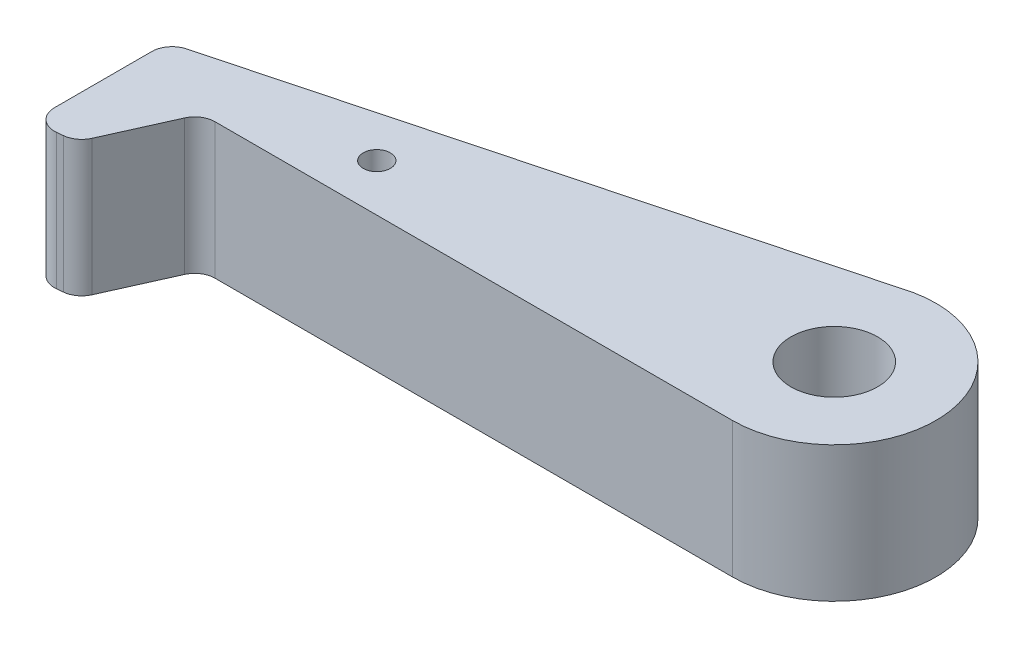
ISO-10303-21;
HEADER;
FILE_DESCRIPTION(('STEP AP214'),'2;1');
FILE_NAME('part.step','',(''),(''),'','','');
FILE_SCHEMA(('AUTOMOTIVE_DESIGN { 1 0 10303 214 1 1 1 1 }'));
ENDSEC;
DATA;
#1=APPLICATION_CONTEXT('core data for automotive mechanical design processes');
#2=APPLICATION_PROTOCOL_DEFINITION('international standard','automotive_design',2000,#1);
#3=PRODUCT_CONTEXT('',#1,'mechanical');
#4=PRODUCT('Part','Part','',(#3));
#5=PRODUCT_RELATED_PRODUCT_CATEGORY('part','',(#4));
#6=PRODUCT_DEFINITION_FORMATION('','',#4);
#7=PRODUCT_DEFINITION_CONTEXT('part definition',#1,'design');
#8=PRODUCT_DEFINITION('design','',#6,#7);
#9=PRODUCT_DEFINITION_SHAPE('','',#8);
#10=(LENGTH_UNIT() NAMED_UNIT(*) SI_UNIT(.MILLI.,.METRE.));
#11=(NAMED_UNIT(*) PLANE_ANGLE_UNIT() SI_UNIT($,.RADIAN.));
#12=(NAMED_UNIT(*) SI_UNIT($,.STERADIAN.) SOLID_ANGLE_UNIT());
#13=UNCERTAINTY_MEASURE_WITH_UNIT(LENGTH_MEASURE(1.E-05),#10,'distance_accuracy_value','');
#14=(GEOMETRIC_REPRESENTATION_CONTEXT(3) GLOBAL_UNCERTAINTY_ASSIGNED_CONTEXT((#13)) GLOBAL_UNIT_ASSIGNED_CONTEXT((#10,
#11,#12)) REPRESENTATION_CONTEXT('',''));
#15=CARTESIAN_POINT('',(0.,0.,0.));
#16=DIRECTION('',(0.,0.,1.));
#17=DIRECTION('',(1.,0.,0.));
#18=AXIS2_PLACEMENT_3D('',#15,#16,#17);
#19=CARTESIAN_POINT('',(45.,10.,-49.1939953097299));
#20=DIRECTION('',(0.,-1.,0.));
#21=DIRECTION('',(0.,0.,-1.));
#22=AXIS2_PLACEMENT_3D('',#19,#20,#21);
#23=CYLINDRICAL_SURFACE('',#22,7.5);
#24=CARTESIAN_POINT('',(45.,0.,-49.1939953097299));
#25=DIRECTION('',(0.,1.,0.));
#26=DIRECTION('',(0.,0.,1.));
#27=AXIS2_PLACEMENT_3D('',#24,#25,#26);
#28=CIRCLE('',#27,7.5);
#29=CARTESIAN_POINT('',(43.4947829026694,0.,-56.541397673144));
#30=VERTEX_POINT('',#29);
#31=CARTESIAN_POINT('',(45.,0.,-41.6939953097299));
#32=VERTEX_POINT('',#31);
#33=EDGE_CURVE('E131',#30,#32,#28,.F.);
#34=ORIENTED_EDGE('',*,*,#33,.F.);
#35=DIRECTION('',(0.,-1.,0.));
#36=VECTOR('',#35,1.);
#37=CARTESIAN_POINT('',(43.4947829026694,10.,-56.541397673144));
#38=LINE('',#37,#36);
#39=CARTESIAN_POINT('',(43.4947829026694,10.,-56.541397673144));
#40=VERTEX_POINT('',#39);
#41=EDGE_CURVE('E125',#40,#30,#38,.T.);
#42=ORIENTED_EDGE('',*,*,#41,.F.);
#43=CARTESIAN_POINT('',(45.,10.,-49.1939953097299));
#44=DIRECTION('',(0.,1.,0.));
#45=DIRECTION('',(0.,0.,1.));
#46=AXIS2_PLACEMENT_3D('',#43,#44,#45);
#47=CIRCLE('',#46,7.5);
#48=CARTESIAN_POINT('',(45.,10.,-41.6939953097299));
#49=VERTEX_POINT('',#48);
#50=EDGE_CURVE('E128',#40,#49,#47,.F.);
#51=ORIENTED_EDGE('',*,*,#50,.T.);
#52=DIRECTION('',(0.,-1.,0.));
#53=VECTOR('',#52,1.);
#54=CARTESIAN_POINT('',(45.,10.,-41.6939953097299));
#55=LINE('',#54,#53);
#56=EDGE_CURVE('E140',#49,#32,#55,.T.);
#57=ORIENTED_EDGE('',*,*,#56,.T.);
#58=EDGE_LOOP('',(#34,#42,#51,#57));
#59=FACE_BOUND('',#58,.T.);
#60=ADVANCED_FACE('F41',(#59),#23,.T.);
#61=CARTESIAN_POINT('',(-11.1553463597061,10.,-42.0399142166743));
#62=DIRECTION('',(-0.256475503847645,0.,-0.966550731170432));
#63=DIRECTION('',(-0.966550731170432,0.,0.256475503847645));
#64=AXIS2_PLACEMENT_3D('',#61,#62,#63);
#65=PLANE('',#64);
#66=DIRECTION('',(0.966550731170432,0.,-0.256475503847645));
#67=VECTOR('',#66,1.);
#68=CARTESIAN_POINT('',(-11.1553463597061,0.,-42.0399142166743));
#69=LINE('',#68,#67);
#70=CARTESIAN_POINT('',(1.11528674422854,0.,-45.2959427999338));
#71=VERTEX_POINT('',#70);
#72=EDGE_CURVE('E165',#71,#30,#69,.T.);
#73=ORIENTED_EDGE('',*,*,#72,.F.);
#74=DIRECTION('',(0.,-1.,0.));
#75=VECTOR('',#74,1.);
#76=CARTESIAN_POINT('',(1.11528674422853,10.,-45.2959427999338));
#77=LINE('',#76,#75);
#78=CARTESIAN_POINT('',(1.11528674422854,10.,-45.2959427999338));
#79=VERTEX_POINT('',#78);
#80=EDGE_CURVE('E123',#71,#79,#77,.F.);
#81=ORIENTED_EDGE('',*,*,#80,.T.);
#82=DIRECTION('',(0.966550731170432,0.,-0.256475503847645));
#83=VECTOR('',#82,1.);
#84=CARTESIAN_POINT('',(-11.1553463597061,10.,-42.0399142166743));
#85=LINE('',#84,#83);
#86=EDGE_CURVE('E117',#79,#40,#85,.T.);
#87=ORIENTED_EDGE('',*,*,#86,.T.);
#88=ORIENTED_EDGE('',*,*,#41,.T.);
#89=EDGE_LOOP('',(#73,#81,#87,#88));
#90=FACE_BOUND('',#89,.T.);
#91=ADVANCED_FACE('F122',(#90),#65,.T.);
#92=CARTESIAN_POINT('',(0.,10.,0.));
#93=DIRECTION('',(1.,0.,0.));
#94=DIRECTION('',(0.,0.,-1.));
#95=AXIS2_PLACEMENT_3D('',#92,#93,#94);
#96=PLANE('',#95);
#97=DIRECTION('',(0.,0.,1.));
#98=VECTOR('',#97,1.);
#99=CARTESIAN_POINT('',(0.,10.,0.));
#100=LINE('',#99,#98);
#101=CARTESIAN_POINT('',(0.,10.,-43.8461167031781));
#102=VERTEX_POINT('',#101);
#103=CARTESIAN_POINT('',(0.,10.,-36.6617909661758));
#104=VERTEX_POINT('',#103);
#105=EDGE_CURVE('E130',#102,#104,#100,.T.);
#106=ORIENTED_EDGE('',*,*,#105,.F.);
#107=DIRECTION('',(0.,-1.,0.));
#108=VECTOR('',#107,1.);
#109=CARTESIAN_POINT('',(0.,0.,-43.8461167031781));
#110=LINE('',#109,#108);
#111=CARTESIAN_POINT('',(0.,0.,-43.8461167031781));
#112=VERTEX_POINT('',#111);
#113=EDGE_CURVE('E178',#102,#112,#110,.T.);
#114=ORIENTED_EDGE('',*,*,#113,.T.);
#115=DIRECTION('',(0.,0.,1.));
#116=VECTOR('',#115,1.);
#117=CARTESIAN_POINT('',(0.,0.,0.));
#118=LINE('',#117,#116);
#119=CARTESIAN_POINT('',(0.,0.,-36.6617909661758));
#120=VERTEX_POINT('',#119);
#121=EDGE_CURVE('E168',#112,#120,#118,.T.);
#122=ORIENTED_EDGE('',*,*,#121,.T.);
#123=DIRECTION('',(0.,-1.,0.));
#124=VECTOR('',#123,1.);
#125=CARTESIAN_POINT('',(0.,10.,-36.6617909661758));
#126=LINE('',#125,#124);
#127=EDGE_CURVE('E137',#120,#104,#126,.F.);
#128=ORIENTED_EDGE('',*,*,#127,.T.);
#129=EDGE_LOOP('',(#106,#114,#122,#128));
#130=FACE_BOUND('',#129,.T.);
#131=ADVANCED_FACE('F225',(#130),#96,.F.);
#132=CARTESIAN_POINT('',(-3.55393201972083,10.,-34.6353309626398));
#133=DIRECTION('',(-0.102074067975896,0.,-0.994776801421732));
#134=DIRECTION('',(-0.994776801421732,0.,0.102074067975896));
#135=AXIS2_PLACEMENT_3D('',#132,#133,#134);
#136=PLANE('',#135);
#137=DIRECTION('',(0.994776801421732,0.,-0.102074067975896));
#138=VECTOR('',#137,1.);
#139=CARTESIAN_POINT('',(-3.55393201972083,10.,-34.6353309626398));
#140=LINE('',#139,#138);
#141=CARTESIAN_POINT('',(1.65311110196385,10.,-35.1696257640432));
#142=VERTEX_POINT('',#141);
#143=CARTESIAN_POINT('',(2.12282842313854,10.,-35.2178234679929));
#144=VERTEX_POINT('',#143);
#145=EDGE_CURVE('E153',#142,#144,#140,.T.);
#146=ORIENTED_EDGE('',*,*,#145,.F.);
#147=DIRECTION('',(0.,-1.,0.));
#148=VECTOR('',#147,1.);
#149=CARTESIAN_POINT('',(1.65311110196384,10.,-35.1696257640432));
#150=LINE('',#149,#148);
#151=CARTESIAN_POINT('',(1.65311110196385,0.,-35.1696257640432));
#152=VERTEX_POINT('',#151);
#153=EDGE_CURVE('E198',#142,#152,#150,.T.);
#154=ORIENTED_EDGE('',*,*,#153,.T.);
#155=DIRECTION('',(0.994776801421732,0.,-0.102074067975896));
#156=VECTOR('',#155,1.);
#157=CARTESIAN_POINT('',(-3.55393201972083,0.,-34.6353309626398));
#158=LINE('',#157,#156);
#159=CARTESIAN_POINT('',(2.12282842313854,0.,-35.2178234679929));
#160=VERTEX_POINT('',#159);
#161=EDGE_CURVE('E169',#152,#160,#158,.T.);
#162=ORIENTED_EDGE('',*,*,#161,.T.);
#163=DIRECTION('',(0.,-1.,0.));
#164=VECTOR('',#163,1.);
#165=CARTESIAN_POINT('',(2.12282842313854,10.,-35.2178234679929));
#166=LINE('',#165,#164);
#167=EDGE_CURVE('E193',#160,#144,#166,.F.);
#168=ORIENTED_EDGE('',*,*,#167,.T.);
#169=EDGE_LOOP('',(#146,#154,#162,#168));
#170=FACE_BOUND('',#169,.T.);
#171=ADVANCED_FACE('F229',(#170),#136,.F.);
#172=CARTESIAN_POINT('',(-10.6918199989386,10.,-4.79195278753464));
#173=DIRECTION('',(-0.912539015114597,0.,-0.408989664776118));
#174=DIRECTION('',(-0.408989664776118,0.,0.912539015114597));
#175=AXIS2_PLACEMENT_3D('',#172,#173,#174);
#176=PLANE('',#175);
#177=DIRECTION('',(0.408989664776118,0.,-0.912539015114597));
#178=VECTOR('',#177,1.);
#179=CARTESIAN_POINT('',(-10.6918199989386,10.,-4.79195278753464));
#180=LINE('',#179,#178);
#181=CARTESIAN_POINT('',(3.3385258438466,10.,-36.0965041729614));
#182=VERTEX_POINT('',#181);
#183=CARTESIAN_POINT('',(5.44993183677132,10.,-40.8074798068941));
#184=VERTEX_POINT('',#183);
#185=EDGE_CURVE('E155',#182,#184,#180,.T.);
#186=ORIENTED_EDGE('',*,*,#185,.F.);
#187=DIRECTION('',(0.,-1.,0.));
#188=VECTOR('',#187,1.);
#189=CARTESIAN_POINT('',(3.33852584384659,10.,-36.0965041729614));
#190=LINE('',#189,#188);
#191=CARTESIAN_POINT('',(3.3385258438466,0.,-36.0965041729614));
#192=VERTEX_POINT('',#191);
#193=EDGE_CURVE('E196',#182,#192,#190,.T.);
#194=ORIENTED_EDGE('',*,*,#193,.T.);
#195=DIRECTION('',(0.408989664776118,0.,-0.912539015114597));
#196=VECTOR('',#195,1.);
#197=CARTESIAN_POINT('',(-10.6918199989386,0.,-4.79195278753464));
#198=LINE('',#197,#196);
#199=CARTESIAN_POINT('',(5.44993183677132,0.,-40.8074798068941));
#200=VERTEX_POINT('',#199);
#201=EDGE_CURVE('E175',#192,#200,#198,.T.);
#202=ORIENTED_EDGE('',*,*,#201,.T.);
#203=DIRECTION('',(0.,-1.,0.));
#204=VECTOR('',#203,1.);
#205=CARTESIAN_POINT('',(5.44993183677132,10.,-40.8074798068941));
#206=LINE('',#205,#204);
#207=EDGE_CURVE('E61',#200,#184,#206,.F.);
#208=ORIENTED_EDGE('',*,*,#207,.T.);
#209=EDGE_LOOP('',(#186,#194,#202,#208));
#210=FACE_BOUND('',#209,.T.);
#211=ADVANCED_FACE('F211',(#210),#176,.F.);
#212=CARTESIAN_POINT('',(45.,10.,-49.1939953097299));
#213=DIRECTION('',(0.,-1.,0.));
#214=DIRECTION('',(0.,0.,-1.));
#215=AXIS2_PLACEMENT_3D('',#212,#213,#214);
#216=CYLINDRICAL_SURFACE('',#215,3.2);
#217=CARTESIAN_POINT('',(45.,10.,-49.1939953097299));
#218=DIRECTION('',(0.,1.,0.));
#219=DIRECTION('',(0.,0.,1.));
#220=AXIS2_PLACEMENT_3D('',#217,#218,#219);
#221=CIRCLE('',#220,3.2);
#222=CARTESIAN_POINT('',(45.,10.,-45.9939953097299));
#223=VERTEX_POINT('',#222);
#224=EDGE_CURVE('E145',#223,#223,#221,.T.);
#225=ORIENTED_EDGE('',*,*,#224,.T.);
#226=EDGE_LOOP('',(#225));
#227=FACE_BOUND('',#226,.T.);
#228=CARTESIAN_POINT('',(45.,0.,-49.1939953097299));
#229=DIRECTION('',(0.,1.,0.));
#230=DIRECTION('',(0.,0.,1.));
#231=AXIS2_PLACEMENT_3D('',#228,#229,#230);
#232=CIRCLE('',#231,3.2);
#233=CARTESIAN_POINT('',(45.,0.,-45.9939953097299));
#234=VERTEX_POINT('',#233);
#235=EDGE_CURVE('E156',#234,#234,#232,.T.);
#236=ORIENTED_EDGE('',*,*,#235,.F.);
#237=EDGE_LOOP('',(#236));
#238=FACE_BOUND('',#237,.T.);
#239=ADVANCED_FACE('F249',(#227,#238),#216,.F.);
#240=CARTESIAN_POINT('',(15.2705040085549,10.,-45.1744097471813));
#241=DIRECTION('',(0.,-1.,0.));
#242=DIRECTION('',(0.,0.,-1.));
#243=AXIS2_PLACEMENT_3D('',#240,#241,#242);
#244=CYLINDRICAL_SURFACE('',#243,1.);
#245=CARTESIAN_POINT('',(15.2705040085549,10.,-45.1744097471813));
#246=DIRECTION('',(0.,1.,0.));
#247=DIRECTION('',(0.,0.,1.));
#248=AXIS2_PLACEMENT_3D('',#245,#246,#247);
#249=CIRCLE('',#248,1.);
#250=CARTESIAN_POINT('',(15.2705040085549,10.,-44.1744097471813));
#251=VERTEX_POINT('',#250);
#252=EDGE_CURVE('E143',#251,#251,#249,.T.);
#253=ORIENTED_EDGE('',*,*,#252,.T.);
#254=EDGE_LOOP('',(#253));
#255=FACE_BOUND('',#254,.T.);
#256=CARTESIAN_POINT('',(15.2705040085549,0.,-45.1744097471813));
#257=DIRECTION('',(0.,1.,0.));
#258=DIRECTION('',(0.,0.,1.));
#259=AXIS2_PLACEMENT_3D('',#256,#257,#258);
#260=CIRCLE('',#259,1.);
#261=CARTESIAN_POINT('',(15.2705040085549,0.,-44.1744097471813));
#262=VERTEX_POINT('',#261);
#263=EDGE_CURVE('E160',#262,#262,#260,.T.);
#264=ORIENTED_EDGE('',*,*,#263,.F.);
#265=EDGE_LOOP('',(#264));
#266=FACE_BOUND('',#265,.T.);
#267=ADVANCED_FACE('F255',(#255,#266),#244,.F.);
#268=CARTESIAN_POINT('',(0.,10.,-41.6939953097299));
#269=DIRECTION('',(0.,0.,-1.));
#270=DIRECTION('',(-1.,0.,0.));
#271=AXIS2_PLACEMENT_3D('',#268,#269,#270);
#272=PLANE('',#271);
#273=DIRECTION('',(1.,0.,0.));
#274=VECTOR('',#273,1.);
#275=CARTESIAN_POINT('',(0.,10.,-41.6939953097299));
#276=LINE('',#275,#274);
#277=CARTESIAN_POINT('',(6.81874035944321,10.,-41.6939953097299));
#278=VERTEX_POINT('',#277);
#279=EDGE_CURVE('E136',#278,#49,#276,.T.);
#280=ORIENTED_EDGE('',*,*,#279,.F.);
#281=DIRECTION('',(0.,-1.,0.));
#282=VECTOR('',#281,1.);
#283=CARTESIAN_POINT('',(6.81874035944321,0.,-41.6939953097299));
#284=LINE('',#283,#282);
#285=CARTESIAN_POINT('',(6.81874035944321,0.,-41.6939953097299));
#286=VERTEX_POINT('',#285);
#287=EDGE_CURVE('E203',#278,#286,#284,.T.);
#288=ORIENTED_EDGE('',*,*,#287,.T.);
#289=DIRECTION('',(1.,0.,0.));
#290=VECTOR('',#289,1.);
#291=CARTESIAN_POINT('',(0.,0.,-41.6939953097299));
#292=LINE('',#291,#290);
#293=EDGE_CURVE('E172',#286,#32,#292,.T.);
#294=ORIENTED_EDGE('',*,*,#293,.T.);
#295=ORIENTED_EDGE('',*,*,#56,.F.);
#296=EDGE_LOOP('',(#280,#288,#294,#295));
#297=FACE_BOUND('',#296,.T.);
#298=ADVANCED_FACE('F212',(#297),#272,.F.);
#299=CARTESIAN_POINT('',(0.,10.,0.));
#300=DIRECTION('',(0.,1.,0.));
#301=DIRECTION('',(0.,0.,1.));
#302=AXIS2_PLACEMENT_3D('',#299,#300,#301);
#303=PLANE('',#302);
#304=ORIENTED_EDGE('',*,*,#252,.F.);
#305=EDGE_LOOP('',(#304));
#306=FACE_BOUND('',#305,.T.);
#307=ORIENTED_EDGE('',*,*,#224,.F.);
#308=EDGE_LOOP('',(#307));
#309=FACE_BOUND('',#308,.T.);
#310=ORIENTED_EDGE('',*,*,#86,.F.);
#311=CARTESIAN_POINT('',(1.5,10.,-43.8461167031781));
#312=DIRECTION('',(0.,1.,0.));
#313=DIRECTION('',(0.,0.,1.));
#314=AXIS2_PLACEMENT_3D('',#311,#312,#313);
#315=CIRCLE('',#314,1.5);
#316=EDGE_CURVE('E191',#79,#102,#315,.T.);
#317=ORIENTED_EDGE('',*,*,#316,.T.);
#318=ORIENTED_EDGE('',*,*,#105,.T.);
#319=CARTESIAN_POINT('',(1.5,10.,-36.6617909661758));
#320=DIRECTION('',(0.,1.,0.));
#321=DIRECTION('',(0.,0.,1.));
#322=AXIS2_PLACEMENT_3D('',#319,#320,#321);
#323=CIRCLE('',#322,1.5);
#324=EDGE_CURVE('E188',#104,#142,#323,.T.);
#325=ORIENTED_EDGE('',*,*,#324,.T.);
#326=ORIENTED_EDGE('',*,*,#145,.T.);
#327=CARTESIAN_POINT('',(1.9697173211747,10.,-36.7099886701255));
#328=DIRECTION('',(0.,1.,0.));
#329=DIRECTION('',(0.,0.,1.));
#330=AXIS2_PLACEMENT_3D('',#327,#328,#329);
#331=CIRCLE('',#330,1.5);
#332=EDGE_CURVE('E189',#144,#182,#331,.T.);
#333=ORIENTED_EDGE('',*,*,#332,.T.);
#334=ORIENTED_EDGE('',*,*,#185,.T.);
#335=CARTESIAN_POINT('',(6.81874035944321,10.,-40.1939953097299));
#336=DIRECTION('',(0.,1.,0.));
#337=DIRECTION('',(0.,0.,1.));
#338=AXIS2_PLACEMENT_3D('',#335,#336,#337);
#339=CIRCLE('',#338,1.5);
#340=EDGE_CURVE('E11',#184,#278,#339,.F.);
#341=ORIENTED_EDGE('',*,*,#340,.T.);
#342=ORIENTED_EDGE('',*,*,#279,.T.);
#343=ORIENTED_EDGE('',*,*,#50,.F.);
#344=EDGE_LOOP('',(#310,#317,#318,#325,#326,#333,#334,#341,#342,#343));
#345=FACE_BOUND('',#344,.T.);
#346=ADVANCED_FACE('F139',(#306,#309,#345),#303,.T.);
#347=CARTESIAN_POINT('',(0.,0.,0.));
#348=DIRECTION('',(0.,1.,0.));
#349=DIRECTION('',(0.,0.,1.));
#350=AXIS2_PLACEMENT_3D('',#347,#348,#349);
#351=PLANE('',#350);
#352=ORIENTED_EDGE('',*,*,#263,.T.);
#353=EDGE_LOOP('',(#352));
#354=FACE_BOUND('',#353,.T.);
#355=ORIENTED_EDGE('',*,*,#235,.T.);
#356=EDGE_LOOP('',(#355));
#357=FACE_BOUND('',#356,.T.);
#358=ORIENTED_EDGE('',*,*,#121,.F.);
#359=CARTESIAN_POINT('',(1.5,0.,-43.8461167031781));
#360=DIRECTION('',(0.,1.,0.));
#361=DIRECTION('',(0.,0.,1.));
#362=AXIS2_PLACEMENT_3D('',#359,#360,#361);
#363=CIRCLE('',#362,1.5);
#364=EDGE_CURVE('E184',#112,#71,#363,.F.);
#365=ORIENTED_EDGE('',*,*,#364,.T.);
#366=ORIENTED_EDGE('',*,*,#72,.T.);
#367=ORIENTED_EDGE('',*,*,#33,.T.);
#368=ORIENTED_EDGE('',*,*,#293,.F.);
#369=CARTESIAN_POINT('',(6.81874035944321,0.,-40.1939953097299));
#370=DIRECTION('',(0.,1.,0.));
#371=DIRECTION('',(0.,0.,1.));
#372=AXIS2_PLACEMENT_3D('',#369,#370,#371);
#373=CIRCLE('',#372,1.5);
#374=EDGE_CURVE('E47',#286,#200,#373,.T.);
#375=ORIENTED_EDGE('',*,*,#374,.T.);
#376=ORIENTED_EDGE('',*,*,#201,.F.);
#377=CARTESIAN_POINT('',(1.9697173211747,0.,-36.7099886701255));
#378=DIRECTION('',(0.,1.,0.));
#379=DIRECTION('',(0.,0.,1.));
#380=AXIS2_PLACEMENT_3D('',#377,#378,#379);
#381=CIRCLE('',#380,1.5);
#382=EDGE_CURVE('E181',#192,#160,#381,.F.);
#383=ORIENTED_EDGE('',*,*,#382,.T.);
#384=ORIENTED_EDGE('',*,*,#161,.F.);
#385=CARTESIAN_POINT('',(1.5,0.,-36.6617909661758));
#386=DIRECTION('',(0.,1.,0.));
#387=DIRECTION('',(0.,0.,1.));
#388=AXIS2_PLACEMENT_3D('',#385,#386,#387);
#389=CIRCLE('',#388,1.5);
#390=EDGE_CURVE('E182',#152,#120,#389,.F.);
#391=ORIENTED_EDGE('',*,*,#390,.T.);
#392=EDGE_LOOP('',(#358,#365,#366,#367,#368,#375,#376,#383,#384,#391));
#393=FACE_BOUND('',#392,.T.);
#394=ADVANCED_FACE('F209',(#354,#357,#393),#351,.F.);
#395=CARTESIAN_POINT('',(1.5,10.,-43.8461167031781));
#396=DIRECTION('',(0.,1.,0.));
#397=DIRECTION('',(0.,0.,1.));
#398=AXIS2_PLACEMENT_3D('',#395,#396,#397);
#399=CYLINDRICAL_SURFACE('',#398,1.5);
#400=ORIENTED_EDGE('',*,*,#316,.F.);
#401=ORIENTED_EDGE('',*,*,#80,.F.);
#402=ORIENTED_EDGE('',*,*,#364,.F.);
#403=ORIENTED_EDGE('',*,*,#113,.F.);
#404=EDGE_LOOP('',(#400,#401,#402,#403));
#405=FACE_BOUND('',#404,.T.);
#406=ADVANCED_FACE('F219',(#405),#399,.T.);
#407=CARTESIAN_POINT('',(1.5,10.,-36.6617909661758));
#408=DIRECTION('',(0.,-1.,0.));
#409=DIRECTION('',(0.,0.,-1.));
#410=AXIS2_PLACEMENT_3D('',#407,#408,#409);
#411=CYLINDRICAL_SURFACE('',#410,1.5);
#412=ORIENTED_EDGE('',*,*,#324,.F.);
#413=ORIENTED_EDGE('',*,*,#127,.F.);
#414=ORIENTED_EDGE('',*,*,#390,.F.);
#415=ORIENTED_EDGE('',*,*,#153,.F.);
#416=EDGE_LOOP('',(#412,#413,#414,#415));
#417=FACE_BOUND('',#416,.T.);
#418=ADVANCED_FACE('F221',(#417),#411,.T.);
#419=CARTESIAN_POINT('',(1.9697173211747,10.,-36.7099886701255));
#420=DIRECTION('',(0.,-1.,0.));
#421=DIRECTION('',(0.,0.,-1.));
#422=AXIS2_PLACEMENT_3D('',#419,#420,#421);
#423=CYLINDRICAL_SURFACE('',#422,1.5);
#424=ORIENTED_EDGE('',*,*,#332,.F.);
#425=ORIENTED_EDGE('',*,*,#167,.F.);
#426=ORIENTED_EDGE('',*,*,#382,.F.);
#427=ORIENTED_EDGE('',*,*,#193,.F.);
#428=EDGE_LOOP('',(#424,#425,#426,#427));
#429=FACE_BOUND('',#428,.T.);
#430=ADVANCED_FACE('F234',(#429),#423,.T.);
#431=CARTESIAN_POINT('',(6.81874035944321,10.,-40.1939953097299));
#432=DIRECTION('',(0.,1.,0.));
#433=DIRECTION('',(0.,0.,1.));
#434=AXIS2_PLACEMENT_3D('',#431,#432,#433);
#435=CYLINDRICAL_SURFACE('',#434,1.5);
#436=ORIENTED_EDGE('',*,*,#340,.F.);
#437=ORIENTED_EDGE('',*,*,#207,.F.);
#438=ORIENTED_EDGE('',*,*,#374,.F.);
#439=ORIENTED_EDGE('',*,*,#287,.F.);
#440=EDGE_LOOP('',(#436,#437,#438,#439));
#441=FACE_BOUND('',#440,.T.);
#442=ADVANCED_FACE('F43',(#441),#435,.F.);
#443=CLOSED_SHELL('',(#60,#91,#131,#171,#211,#239,#267,#298,#346,#394,#406,#418,#430,#442));
#444=MANIFOLD_SOLID_BREP('B2',#443);
#445=ADVANCED_BREP_SHAPE_REPRESENTATION('',(#18,#444),#14);
#446=SHAPE_DEFINITION_REPRESENTATION(#9,#445);
ENDSEC;
END-ISO-10303-21;
